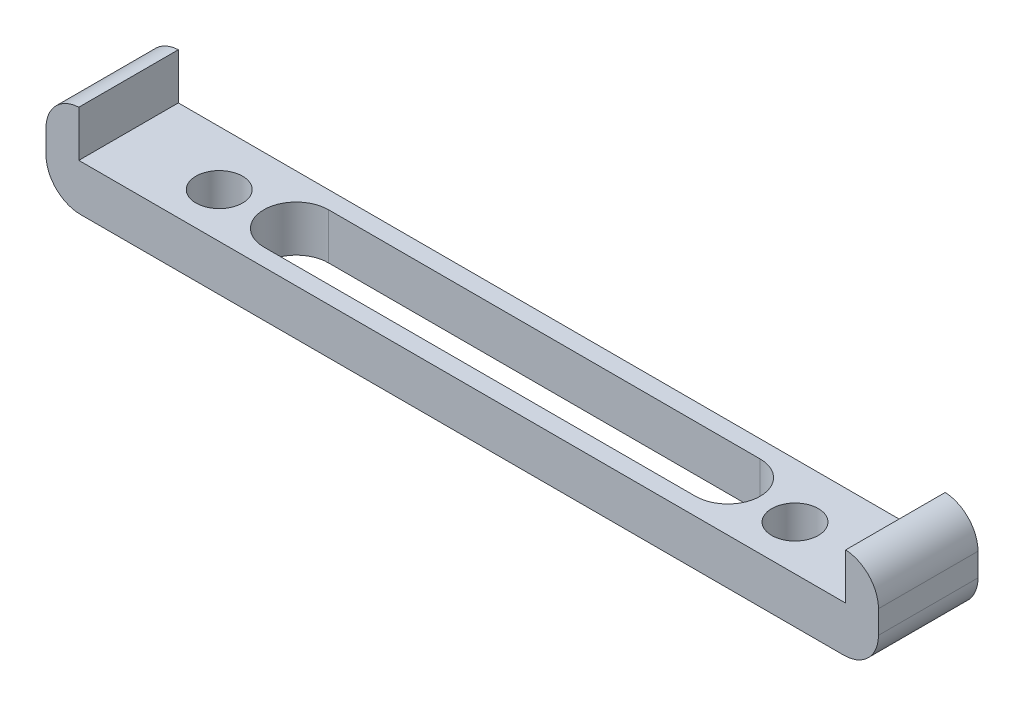
ISO-10303-21;
HEADER;
FILE_DESCRIPTION(('STEP AP214'),'2;1');
FILE_NAME('part.step','',(''),(''),'','','');
FILE_SCHEMA(('AUTOMOTIVE_DESIGN { 1 0 10303 214 1 1 1 1 }'));
ENDSEC;
DATA;
#1=APPLICATION_CONTEXT('core data for automotive mechanical design processes');
#2=APPLICATION_PROTOCOL_DEFINITION('international standard','automotive_design',2000,#1);
#3=PRODUCT_CONTEXT('',#1,'mechanical');
#4=PRODUCT('Part','Part','',(#3));
#5=PRODUCT_RELATED_PRODUCT_CATEGORY('part','',(#4));
#6=PRODUCT_DEFINITION_FORMATION('','',#4);
#7=PRODUCT_DEFINITION_CONTEXT('part definition',#1,'design');
#8=PRODUCT_DEFINITION('design','',#6,#7);
#9=PRODUCT_DEFINITION_SHAPE('','',#8);
#10=(LENGTH_UNIT() NAMED_UNIT(*) SI_UNIT(.MILLI.,.METRE.));
#11=(NAMED_UNIT(*) PLANE_ANGLE_UNIT() SI_UNIT($,.RADIAN.));
#12=(NAMED_UNIT(*) SI_UNIT($,.STERADIAN.) SOLID_ANGLE_UNIT());
#13=UNCERTAINTY_MEASURE_WITH_UNIT(LENGTH_MEASURE(1.E-05),#10,'distance_accuracy_value','');
#14=(GEOMETRIC_REPRESENTATION_CONTEXT(3) GLOBAL_UNCERTAINTY_ASSIGNED_CONTEXT((#13)) GLOBAL_UNIT_ASSIGNED_CONTEXT((#10,
#11,#12)) REPRESENTATION_CONTEXT('',''));
#15=CARTESIAN_POINT('',(0.,0.,0.));
#16=DIRECTION('',(0.,0.,1.));
#17=DIRECTION('',(1.,0.,0.));
#18=AXIS2_PLACEMENT_3D('',#15,#16,#17);
#19=CARTESIAN_POINT('',(0.,41.59,0.));
#20=DIRECTION('',(0.,1.,0.));
#21=DIRECTION('',(0.,0.,1.));
#22=AXIS2_PLACEMENT_3D('',#19,#20,#21);
#23=PLANE('',#22);
#24=CARTESIAN_POINT('',(14.4028052431113,41.59,-8.85234871179528));
#25=DIRECTION('',(0.,1.,0.));
#26=DIRECTION('',(0.,0.,1.));
#27=AXIS2_PLACEMENT_3D('',#24,#25,#26);
#28=CIRCLE('',#27,2.80817591076612);
#29=CARTESIAN_POINT('',(14.4028052431113,41.59,-11.6605246225614));
#30=VERTEX_POINT('',#29);
#31=CARTESIAN_POINT('',(14.4028052431113,41.59,-6.04417280102916));
#32=VERTEX_POINT('',#31);
#33=EDGE_CURVE('E89',#30,#32,#28,.T.);
#34=ORIENTED_EDGE('',*,*,#33,.F.);
#35=DIRECTION('',(-1.,0.,0.));
#36=VECTOR('',#35,1.);
#37=CARTESIAN_POINT('',(14.4028052431113,41.59,-11.6605246225614));
#38=LINE('',#37,#36);
#39=CARTESIAN_POINT('',(51.8871947568886,41.59,-11.6605246225614));
#40=VERTEX_POINT('',#39);
#41=EDGE_CURVE('E193',#40,#30,#38,.T.);
#42=ORIENTED_EDGE('',*,*,#41,.F.);
#43=CARTESIAN_POINT('',(51.8871947568886,41.59,-8.85234871179528));
#44=DIRECTION('',(0.,1.,0.));
#45=DIRECTION('',(0.,0.,-1.));
#46=AXIS2_PLACEMENT_3D('',#43,#44,#45);
#47=CIRCLE('',#46,2.80817591076612);
#48=CARTESIAN_POINT('',(51.8871947568886,41.59,-6.04417280102916));
#49=VERTEX_POINT('',#48);
#50=EDGE_CURVE('E178',#49,#40,#47,.T.);
#51=ORIENTED_EDGE('',*,*,#50,.F.);
#52=DIRECTION('',(1.,0.,0.));
#53=VECTOR('',#52,1.);
#54=CARTESIAN_POINT('',(14.4028052431113,41.59,-6.04417280102916));
#55=LINE('',#54,#53);
#56=EDGE_CURVE('E187',#32,#49,#55,.T.);
#57=ORIENTED_EDGE('',*,*,#56,.F.);
#58=EDGE_LOOP('',(#34,#42,#51,#57));
#59=FACE_BOUND('',#58,.T.);
#60=CARTESIAN_POINT('',(58.145,41.59,-8.43));
#61=DIRECTION('',(0.,-1.,0.));
#62=DIRECTION('',(0.,0.,1.));
#63=AXIS2_PLACEMENT_3D('',#60,#61,#62);
#64=CIRCLE('',#63,2.025);
#65=CARTESIAN_POINT('',(58.145,41.59,-6.405));
#66=VERTEX_POINT('',#65);
#67=EDGE_CURVE('E243',#66,#66,#64,.T.);
#68=ORIENTED_EDGE('',*,*,#67,.T.);
#69=EDGE_LOOP('',(#68));
#70=FACE_BOUND('',#69,.T.);
#71=CARTESIAN_POINT('',(8.145,41.59,-8.43));
#72=DIRECTION('',(0.,1.,0.));
#73=DIRECTION('',(0.,0.,1.));
#74=AXIS2_PLACEMENT_3D('',#71,#72,#73);
#75=CIRCLE('',#74,2.025);
#76=CARTESIAN_POINT('',(8.145,41.59,-6.405));
#77=VERTEX_POINT('',#76);
#78=EDGE_CURVE('E230',#77,#77,#75,.T.);
#79=ORIENTED_EDGE('',*,*,#78,.F.);
#80=EDGE_LOOP('',(#79));
#81=FACE_BOUND('',#80,.T.);
#82=DIRECTION('',(-1.,0.,0.));
#83=VECTOR('',#82,1.);
#84=CARTESIAN_POINT('',(0.,41.59,-4.53));
#85=LINE('',#84,#83);
#86=CARTESIAN_POINT('',(66.44,41.59,-4.53));
#87=VERTEX_POINT('',#86);
#88=CARTESIAN_POINT('',(-0.149999999999996,41.59,-4.53));
#89=VERTEX_POINT('',#88);
#90=EDGE_CURVE('E234',#87,#89,#85,.T.);
#91=ORIENTED_EDGE('',*,*,#90,.F.);
#92=DIRECTION('',(0.,0.,1.));
#93=VECTOR('',#92,1.);
#94=CARTESIAN_POINT('',(66.44,41.59,-13.1746974235906));
#95=LINE('',#94,#93);
#96=CARTESIAN_POINT('',(66.44,41.59,-13.1746974235906));
#97=VERTEX_POINT('',#96);
#98=EDGE_CURVE('E200',#97,#87,#95,.T.);
#99=ORIENTED_EDGE('',*,*,#98,.F.);
#100=DIRECTION('',(1.,0.,0.));
#101=VECTOR('',#100,1.);
#102=CARTESIAN_POINT('',(0.,41.59,-13.1746974235906));
#103=LINE('',#102,#101);
#104=CARTESIAN_POINT('',(-0.149999999999996,41.59,-13.1746974235906));
#105=VERTEX_POINT('',#104);
#106=EDGE_CURVE('E229',#105,#97,#103,.T.);
#107=ORIENTED_EDGE('',*,*,#106,.F.);
#108=DIRECTION('',(0.,0.,-1.));
#109=VECTOR('',#108,1.);
#110=CARTESIAN_POINT('',(-0.149999999999996,41.59,-13.1746974235906));
#111=LINE('',#110,#109);
#112=EDGE_CURVE('E212',#89,#105,#111,.T.);
#113=ORIENTED_EDGE('',*,*,#112,.F.);
#114=EDGE_LOOP('',(#91,#99,#107,#113));
#115=FACE_BOUND('',#114,.T.);
#116=ADVANCED_FACE('F74',(#59,#70,#81,#115),#23,.T.);
#117=CARTESIAN_POINT('',(58.145,37.59,-8.43));
#118=DIRECTION('',(0.,1.,0.));
#119=DIRECTION('',(-1.,0.,0.));
#120=AXIS2_PLACEMENT_3D('',#117,#118,#119);
#121=CYLINDRICAL_SURFACE('',#120,2.025);
#122=CARTESIAN_POINT('',(58.145,37.59,-8.43));
#123=DIRECTION('',(0.,-1.,0.));
#124=DIRECTION('',(0.,0.,1.));
#125=AXIS2_PLACEMENT_3D('',#122,#123,#124);
#126=CIRCLE('',#125,2.025);
#127=CARTESIAN_POINT('',(58.145,37.59,-6.405));
#128=VERTEX_POINT('',#127);
#129=EDGE_CURVE('E224',#128,#128,#126,.T.);
#130=ORIENTED_EDGE('',*,*,#129,.T.);
#131=EDGE_LOOP('',(#130));
#132=FACE_BOUND('',#131,.T.);
#133=ORIENTED_EDGE('',*,*,#67,.F.);
#134=EDGE_LOOP('',(#133));
#135=FACE_BOUND('',#134,.T.);
#136=ADVANCED_FACE('F311',(#132,#135),#121,.F.);
#137=CARTESIAN_POINT('',(8.145,37.59,-8.43));
#138=DIRECTION('',(0.,1.,0.));
#139=DIRECTION('',(0.,0.,1.));
#140=AXIS2_PLACEMENT_3D('',#137,#138,#139);
#141=CYLINDRICAL_SURFACE('',#140,2.025);
#142=CARTESIAN_POINT('',(8.145,37.59,-8.43));
#143=DIRECTION('',(0.,1.,0.));
#144=DIRECTION('',(0.,0.,1.));
#145=AXIS2_PLACEMENT_3D('',#142,#143,#144);
#146=CIRCLE('',#145,2.025);
#147=CARTESIAN_POINT('',(8.145,37.59,-6.405));
#148=VERTEX_POINT('',#147);
#149=EDGE_CURVE('E225',#148,#148,#146,.T.);
#150=ORIENTED_EDGE('',*,*,#149,.F.);
#151=EDGE_LOOP('',(#150));
#152=FACE_BOUND('',#151,.T.);
#153=ORIENTED_EDGE('',*,*,#78,.T.);
#154=EDGE_LOOP('',(#153));
#155=FACE_BOUND('',#154,.T.);
#156=ADVANCED_FACE('F316',(#152,#155),#141,.F.);
#157=CARTESIAN_POINT('',(-2.99999999999999,37.59,0.));
#158=DIRECTION('',(-1.,0.,0.));
#159=DIRECTION('',(0.,0.,1.));
#160=AXIS2_PLACEMENT_3D('',#157,#158,#159);
#161=PLANE('',#160);
#162=DIRECTION('',(0.,1.,0.));
#163=VECTOR('',#162,1.);
#164=CARTESIAN_POINT('',(-2.99999999999999,37.59,-4.53));
#165=LINE('',#164,#163);
#166=CARTESIAN_POINT('',(-2.99999999999999,40.59,-4.53));
#167=VERTEX_POINT('',#166);
#168=CARTESIAN_POINT('',(-2.99999999999999,42.5937523466843,-4.53));
#169=VERTEX_POINT('',#168);
#170=EDGE_CURVE('E233',#167,#169,#165,.T.);
#171=ORIENTED_EDGE('',*,*,#170,.T.);
#172=DIRECTION('',(0.,0.,-1.));
#173=VECTOR('',#172,1.);
#174=CARTESIAN_POINT('',(-3.,42.5937523466843,-13.1746974235906));
#175=LINE('',#174,#173);
#176=CARTESIAN_POINT('',(-3.,42.5937523466843,-13.1746974235906));
#177=VERTEX_POINT('',#176);
#178=EDGE_CURVE('E282',#169,#177,#175,.T.);
#179=ORIENTED_EDGE('',*,*,#178,.T.);
#180=DIRECTION('',(0.,1.,0.));
#181=VECTOR('',#180,1.);
#182=CARTESIAN_POINT('',(-3.,37.59,-13.1746974235906));
#183=LINE('',#182,#181);
#184=CARTESIAN_POINT('',(-3.,40.59,-13.1746974235906));
#185=VERTEX_POINT('',#184);
#186=EDGE_CURVE('E240',#185,#177,#183,.T.);
#187=ORIENTED_EDGE('',*,*,#186,.F.);
#188=DIRECTION('',(0.,0.,1.));
#189=VECTOR('',#188,1.);
#190=CARTESIAN_POINT('',(-2.99999999999999,40.59,-4.53));
#191=LINE('',#190,#189);
#192=EDGE_CURVE('E279',#185,#167,#191,.T.);
#193=ORIENTED_EDGE('',*,*,#192,.T.);
#194=EDGE_LOOP('',(#171,#179,#187,#193));
#195=FACE_BOUND('',#194,.T.);
#196=ADVANCED_FACE('F349',(#195),#161,.T.);
#197=CARTESIAN_POINT('',(69.29,37.59,0.));
#198=DIRECTION('',(-1.,0.,0.));
#199=DIRECTION('',(0.,-1.,0.));
#200=AXIS2_PLACEMENT_3D('',#197,#198,#199);
#201=PLANE('',#200);
#202=DIRECTION('',(0.,1.,0.));
#203=VECTOR('',#202,1.);
#204=CARTESIAN_POINT('',(69.29,37.59,-13.1746974235906));
#205=LINE('',#204,#203);
#206=CARTESIAN_POINT('',(69.29,40.59,-13.1746974235906));
#207=VERTEX_POINT('',#206);
#208=CARTESIAN_POINT('',(69.29,42.5937523466843,-13.1746974235906));
#209=VERTEX_POINT('',#208);
#210=EDGE_CURVE('E249',#207,#209,#205,.T.);
#211=ORIENTED_EDGE('',*,*,#210,.T.);
#212=DIRECTION('',(0.,0.,1.));
#213=VECTOR('',#212,1.);
#214=CARTESIAN_POINT('',(69.29,42.5937523466843,0.));
#215=LINE('',#214,#213);
#216=CARTESIAN_POINT('',(69.29,42.5937523466843,-4.53000000000001));
#217=VERTEX_POINT('',#216);
#218=EDGE_CURVE('E269',#209,#217,#215,.T.);
#219=ORIENTED_EDGE('',*,*,#218,.T.);
#220=DIRECTION('',(0.,1.,0.));
#221=VECTOR('',#220,1.);
#222=CARTESIAN_POINT('',(69.29,37.59,-4.53));
#223=LINE('',#222,#221);
#224=CARTESIAN_POINT('',(69.29,40.59,-4.53));
#225=VERTEX_POINT('',#224);
#226=EDGE_CURVE('E237',#225,#217,#223,.T.);
#227=ORIENTED_EDGE('',*,*,#226,.F.);
#228=DIRECTION('',(0.,0.,1.));
#229=VECTOR('',#228,1.);
#230=CARTESIAN_POINT('',(69.29,40.59,0.));
#231=LINE('',#230,#229);
#232=EDGE_CURVE('E267',#225,#207,#231,.F.);
#233=ORIENTED_EDGE('',*,*,#232,.T.);
#234=EDGE_LOOP('',(#211,#219,#227,#233));
#235=FACE_BOUND('',#234,.T.);
#236=ADVANCED_FACE('F368',(#235),#201,.F.);
#237=CARTESIAN_POINT('',(66.29,37.59,0.));
#238=DIRECTION('',(0.,1.,0.));
#239=DIRECTION('',(0.,0.,1.));
#240=AXIS2_PLACEMENT_3D('',#237,#238,#239);
#241=PLANE('',#240);
#242=DIRECTION('',(-1.,0.,0.));
#243=VECTOR('',#242,1.);
#244=CARTESIAN_POINT('',(66.29,37.59,-11.6605246225614));
#245=LINE('',#244,#243);
#246=CARTESIAN_POINT('',(51.8871947568886,37.59,-11.6605246225614));
#247=VERTEX_POINT('',#246);
#248=CARTESIAN_POINT('',(14.4028052431113,37.59,-11.6605246225614));
#249=VERTEX_POINT('',#248);
#250=EDGE_CURVE('E82',#247,#249,#245,.T.);
#251=ORIENTED_EDGE('',*,*,#250,.T.);
#252=CARTESIAN_POINT('',(14.4028052431113,37.59,-8.85234871179528));
#253=DIRECTION('',(0.,1.,0.));
#254=DIRECTION('',(-1.,0.,0.));
#255=AXIS2_PLACEMENT_3D('',#252,#253,#254);
#256=CIRCLE('',#255,2.80817591076612);
#257=CARTESIAN_POINT('',(14.4028052431113,37.59,-6.04417280102916));
#258=VERTEX_POINT('',#257);
#259=EDGE_CURVE('E12',#249,#258,#256,.T.);
#260=ORIENTED_EDGE('',*,*,#259,.T.);
#261=DIRECTION('',(1.,0.,0.));
#262=VECTOR('',#261,1.);
#263=CARTESIAN_POINT('',(66.29,37.59,-6.04417280102916));
#264=LINE('',#263,#262);
#265=CARTESIAN_POINT('',(51.8871947568886,37.59,-6.04417280102916));
#266=VERTEX_POINT('',#265);
#267=EDGE_CURVE('E289',#258,#266,#264,.T.);
#268=ORIENTED_EDGE('',*,*,#267,.T.);
#269=CARTESIAN_POINT('',(51.8871947568886,37.59,-8.85234871179528));
#270=DIRECTION('',(0.,1.,0.));
#271=DIRECTION('',(-1.,0.,0.));
#272=AXIS2_PLACEMENT_3D('',#269,#270,#271);
#273=CIRCLE('',#272,2.80817591076612);
#274=EDGE_CURVE('E181',#266,#247,#273,.T.);
#275=ORIENTED_EDGE('',*,*,#274,.T.);
#276=EDGE_LOOP('',(#251,#260,#268,#275));
#277=FACE_BOUND('',#276,.T.);
#278=DIRECTION('',(-1.,0.,0.));
#279=VECTOR('',#278,1.);
#280=CARTESIAN_POINT('',(66.29,37.59,-13.1746974235906));
#281=LINE('',#280,#279);
#282=CARTESIAN_POINT('',(66.29,37.59,-13.1746974235906));
#283=VERTEX_POINT('',#282);
#284=CARTESIAN_POINT('',(0.,37.59,-13.1746974235906));
#285=VERTEX_POINT('',#284);
#286=EDGE_CURVE('E236',#283,#285,#281,.T.);
#287=ORIENTED_EDGE('',*,*,#286,.F.);
#288=DIRECTION('',(0.,0.,1.));
#289=VECTOR('',#288,1.);
#290=CARTESIAN_POINT('',(66.29,37.59,0.));
#291=LINE('',#290,#289);
#292=CARTESIAN_POINT('',(66.29,37.59,-4.53000000000001));
#293=VERTEX_POINT('',#292);
#294=EDGE_CURVE('E286',#283,#293,#291,.T.);
#295=ORIENTED_EDGE('',*,*,#294,.T.);
#296=DIRECTION('',(1.,0.,0.));
#297=VECTOR('',#296,1.);
#298=CARTESIAN_POINT('',(0.,37.59,-4.53));
#299=LINE('',#298,#297);
#300=CARTESIAN_POINT('',(0.,37.59,-4.53));
#301=VERTEX_POINT('',#300);
#302=EDGE_CURVE('E248',#301,#293,#299,.T.);
#303=ORIENTED_EDGE('',*,*,#302,.F.);
#304=DIRECTION('',(0.,0.,1.));
#305=VECTOR('',#304,1.);
#306=CARTESIAN_POINT('',(0.,37.59,-13.1746974235906));
#307=LINE('',#306,#305);
#308=EDGE_CURVE('E284',#301,#285,#307,.F.);
#309=ORIENTED_EDGE('',*,*,#308,.T.);
#310=EDGE_LOOP('',(#287,#295,#303,#309));
#311=FACE_BOUND('',#310,.T.);
#312=ORIENTED_EDGE('',*,*,#149,.T.);
#313=EDGE_LOOP('',(#312));
#314=FACE_BOUND('',#313,.T.);
#315=ORIENTED_EDGE('',*,*,#129,.F.);
#316=EDGE_LOOP('',(#315));
#317=FACE_BOUND('',#316,.T.);
#318=ADVANCED_FACE('F293',(#277,#311,#314,#317),#241,.F.);
#319=CARTESIAN_POINT('',(0.,37.59,-4.53));
#320=DIRECTION('',(0.,0.,-1.));
#321=DIRECTION('',(-1.,0.,0.));
#322=AXIS2_PLACEMENT_3D('',#319,#320,#321);
#323=PLANE('',#322);
#324=ORIENTED_EDGE('',*,*,#226,.T.);
#325=CARTESIAN_POINT('',(66.2899999999999,42.5937523466843,-4.53000000000001));
#326=DIRECTION('',(0.,0.,-1.));
#327=DIRECTION('',(-1.,0.,0.));
#328=AXIS2_PLACEMENT_3D('',#325,#326,#327);
#329=CIRCLE('',#328,3.);
#330=CARTESIAN_POINT('',(66.44,45.59,-4.53));
#331=VERTEX_POINT('',#330);
#332=EDGE_CURVE('E277',#217,#331,#329,.F.);
#333=ORIENTED_EDGE('',*,*,#332,.T.);
#334=DIRECTION('',(0.,-1.,0.));
#335=VECTOR('',#334,1.);
#336=CARTESIAN_POINT('',(66.44,45.59,-4.53));
#337=LINE('',#336,#335);
#338=EDGE_CURVE('E206',#331,#87,#337,.T.);
#339=ORIENTED_EDGE('',*,*,#338,.T.);
#340=ORIENTED_EDGE('',*,*,#90,.T.);
#341=DIRECTION('',(0.,-1.,0.));
#342=VECTOR('',#341,1.);
#343=CARTESIAN_POINT('',(-0.149999999999997,45.59,-4.53));
#344=LINE('',#343,#342);
#345=CARTESIAN_POINT('',(-0.149999999999997,45.59,-4.53));
#346=VERTEX_POINT('',#345);
#347=EDGE_CURVE('E221',#346,#89,#344,.T.);
#348=ORIENTED_EDGE('',*,*,#347,.F.);
#349=CARTESIAN_POINT('',(0.,42.5937523466843,-4.53));
#350=DIRECTION('',(0.,0.,-1.));
#351=DIRECTION('',(-1.,0.,0.));
#352=AXIS2_PLACEMENT_3D('',#349,#350,#351);
#353=CIRCLE('',#352,3.);
#354=EDGE_CURVE('E275',#346,#169,#353,.F.);
#355=ORIENTED_EDGE('',*,*,#354,.T.);
#356=ORIENTED_EDGE('',*,*,#170,.F.);
#357=CARTESIAN_POINT('',(0.,40.59,-4.53));
#358=DIRECTION('',(0.,0.,-1.));
#359=DIRECTION('',(-1.,0.,0.));
#360=AXIS2_PLACEMENT_3D('',#357,#358,#359);
#361=CIRCLE('',#360,3.);
#362=EDGE_CURVE('E271',#167,#301,#361,.F.);
#363=ORIENTED_EDGE('',*,*,#362,.T.);
#364=ORIENTED_EDGE('',*,*,#302,.T.);
#365=CARTESIAN_POINT('',(66.29,40.59,-4.53000000000001));
#366=DIRECTION('',(0.,0.,-1.));
#367=DIRECTION('',(-1.,0.,0.));
#368=AXIS2_PLACEMENT_3D('',#365,#366,#367);
#369=CIRCLE('',#368,3.);
#370=EDGE_CURVE('E273',#293,#225,#369,.F.);
#371=ORIENTED_EDGE('',*,*,#370,.T.);
#372=EDGE_LOOP('',(#324,#333,#339,#340,#348,#355,#356,#363,#364,#371));
#373=FACE_BOUND('',#372,.T.);
#374=ADVANCED_FACE('F370',(#373),#323,.F.);
#375=CARTESIAN_POINT('',(0.,37.59,-13.1746974235906));
#376=DIRECTION('',(0.,0.,1.));
#377=DIRECTION('',(1.,0.,0.));
#378=AXIS2_PLACEMENT_3D('',#375,#376,#377);
#379=PLANE('',#378);
#380=DIRECTION('',(0.,-1.,0.));
#381=VECTOR('',#380,1.);
#382=CARTESIAN_POINT('',(66.44,45.59,-13.1746974235906));
#383=LINE('',#382,#381);
#384=CARTESIAN_POINT('',(66.44,45.59,-13.1746974235906));
#385=VERTEX_POINT('',#384);
#386=EDGE_CURVE('E210',#385,#97,#383,.T.);
#387=ORIENTED_EDGE('',*,*,#386,.F.);
#388=CARTESIAN_POINT('',(66.2899999999999,42.5937523466843,-13.1746974235906));
#389=DIRECTION('',(0.,0.,1.));
#390=DIRECTION('',(1.,0.,0.));
#391=AXIS2_PLACEMENT_3D('',#388,#389,#390);
#392=CIRCLE('',#391,3.);
#393=EDGE_CURVE('E265',#385,#209,#392,.F.);
#394=ORIENTED_EDGE('',*,*,#393,.T.);
#395=ORIENTED_EDGE('',*,*,#210,.F.);
#396=CARTESIAN_POINT('',(66.29,40.59,-13.1746974235906));
#397=DIRECTION('',(0.,0.,1.));
#398=DIRECTION('',(1.,0.,0.));
#399=AXIS2_PLACEMENT_3D('',#396,#397,#398);
#400=CIRCLE('',#399,3.);
#401=EDGE_CURVE('E261',#207,#283,#400,.F.);
#402=ORIENTED_EDGE('',*,*,#401,.T.);
#403=ORIENTED_EDGE('',*,*,#286,.T.);
#404=CARTESIAN_POINT('',(0.,40.59,-13.1746974235906));
#405=DIRECTION('',(0.,0.,1.));
#406=DIRECTION('',(1.,0.,0.));
#407=AXIS2_PLACEMENT_3D('',#404,#405,#406);
#408=CIRCLE('',#407,3.);
#409=EDGE_CURVE('E228',#285,#185,#408,.F.);
#410=ORIENTED_EDGE('',*,*,#409,.T.);
#411=ORIENTED_EDGE('',*,*,#186,.T.);
#412=CARTESIAN_POINT('',(0.,42.5937523466843,-13.1746974235906));
#413=DIRECTION('',(0.,0.,1.));
#414=DIRECTION('',(1.,0.,0.));
#415=AXIS2_PLACEMENT_3D('',#412,#413,#414);
#416=CIRCLE('',#415,3.);
#417=CARTESIAN_POINT('',(-0.149999999999996,45.59,-13.1746974235906));
#418=VERTEX_POINT('',#417);
#419=EDGE_CURVE('E263',#177,#418,#416,.F.);
#420=ORIENTED_EDGE('',*,*,#419,.T.);
#421=DIRECTION('',(0.,-1.,0.));
#422=VECTOR('',#421,1.);
#423=CARTESIAN_POINT('',(-0.149999999999996,45.59,-13.1746974235906));
#424=LINE('',#423,#422);
#425=EDGE_CURVE('E216',#418,#105,#424,.T.);
#426=ORIENTED_EDGE('',*,*,#425,.T.);
#427=ORIENTED_EDGE('',*,*,#106,.T.);
#428=EDGE_LOOP('',(#387,#394,#395,#402,#403,#410,#411,#420,#426,#427));
#429=FACE_BOUND('',#428,.T.);
#430=ADVANCED_FACE('F340',(#429),#379,.F.);
#431=CARTESIAN_POINT('',(-0.149999999999996,45.59,-13.1746974235906));
#432=DIRECTION('',(-1.,0.,0.));
#433=DIRECTION('',(0.,0.,1.));
#434=AXIS2_PLACEMENT_3D('',#431,#432,#433);
#435=PLANE('',#434);
#436=ORIENTED_EDGE('',*,*,#112,.T.);
#437=ORIENTED_EDGE('',*,*,#425,.F.);
#438=DIRECTION('',(0.,0.,-1.));
#439=VECTOR('',#438,1.);
#440=CARTESIAN_POINT('',(-0.149999999999996,45.59,-13.1746974235906));
#441=LINE('',#440,#439);
#442=EDGE_CURVE('E213',#346,#418,#441,.T.);
#443=ORIENTED_EDGE('',*,*,#442,.F.);
#444=ORIENTED_EDGE('',*,*,#347,.T.);
#445=EDGE_LOOP('',(#436,#437,#443,#444));
#446=FACE_BOUND('',#445,.T.);
#447=ADVANCED_FACE('F356',(#446),#435,.F.);
#448=CARTESIAN_POINT('',(66.44,45.59,-13.1746974235906));
#449=DIRECTION('',(1.,0.,0.));
#450=DIRECTION('',(0.,0.,-1.));
#451=AXIS2_PLACEMENT_3D('',#448,#449,#450);
#452=PLANE('',#451);
#453=ORIENTED_EDGE('',*,*,#98,.T.);
#454=ORIENTED_EDGE('',*,*,#338,.F.);
#455=DIRECTION('',(0.,0.,1.));
#456=VECTOR('',#455,1.);
#457=CARTESIAN_POINT('',(66.44,45.59,-13.1746974235906));
#458=LINE('',#457,#456);
#459=EDGE_CURVE('E203',#385,#331,#458,.T.);
#460=ORIENTED_EDGE('',*,*,#459,.F.);
#461=ORIENTED_EDGE('',*,*,#386,.T.);
#462=EDGE_LOOP('',(#453,#454,#460,#461));
#463=FACE_BOUND('',#462,.T.);
#464=ADVANCED_FACE('F325',(#463),#452,.F.);
#465=CARTESIAN_POINT('',(66.2899999999999,42.5937523466843,0.));
#466=DIRECTION('',(0.,0.,1.));
#467=DIRECTION('',(1.,0.,0.));
#468=AXIS2_PLACEMENT_3D('',#465,#466,#467);
#469=CYLINDRICAL_SURFACE('',#468,3.);
#470=ORIENTED_EDGE('',*,*,#332,.F.);
#471=ORIENTED_EDGE('',*,*,#218,.F.);
#472=ORIENTED_EDGE('',*,*,#393,.F.);
#473=ORIENTED_EDGE('',*,*,#459,.T.);
#474=EDGE_LOOP('',(#470,#471,#472,#473));
#475=FACE_BOUND('',#474,.T.);
#476=ADVANCED_FACE('F321',(#475),#469,.T.);
#477=CARTESIAN_POINT('',(0.,42.5937523466843,0.));
#478=DIRECTION('',(0.,0.,1.));
#479=DIRECTION('',(1.,0.,0.));
#480=AXIS2_PLACEMENT_3D('',#477,#478,#479);
#481=CYLINDRICAL_SURFACE('',#480,3.);
#482=ORIENTED_EDGE('',*,*,#419,.F.);
#483=ORIENTED_EDGE('',*,*,#178,.F.);
#484=ORIENTED_EDGE('',*,*,#354,.F.);
#485=ORIENTED_EDGE('',*,*,#442,.T.);
#486=EDGE_LOOP('',(#482,#483,#484,#485));
#487=FACE_BOUND('',#486,.T.);
#488=ADVANCED_FACE('F324',(#487),#481,.T.);
#489=CARTESIAN_POINT('',(66.29,40.59,0.));
#490=DIRECTION('',(0.,0.,1.));
#491=DIRECTION('',(1.,0.,0.));
#492=AXIS2_PLACEMENT_3D('',#489,#490,#491);
#493=CYLINDRICAL_SURFACE('',#492,3.);
#494=ORIENTED_EDGE('',*,*,#401,.F.);
#495=ORIENTED_EDGE('',*,*,#232,.F.);
#496=ORIENTED_EDGE('',*,*,#370,.F.);
#497=ORIENTED_EDGE('',*,*,#294,.F.);
#498=EDGE_LOOP('',(#494,#495,#496,#497));
#499=FACE_BOUND('',#498,.T.);
#500=ADVANCED_FACE('F306',(#499),#493,.T.);
#501=CARTESIAN_POINT('',(0.,40.59,0.));
#502=DIRECTION('',(0.,0.,-1.));
#503=DIRECTION('',(-1.,0.,0.));
#504=AXIS2_PLACEMENT_3D('',#501,#502,#503);
#505=CYLINDRICAL_SURFACE('',#504,3.);
#506=ORIENTED_EDGE('',*,*,#409,.F.);
#507=ORIENTED_EDGE('',*,*,#308,.F.);
#508=ORIENTED_EDGE('',*,*,#362,.F.);
#509=ORIENTED_EDGE('',*,*,#192,.F.);
#510=EDGE_LOOP('',(#506,#507,#508,#509));
#511=FACE_BOUND('',#510,.T.);
#512=ADVANCED_FACE('F76',(#511),#505,.T.);
#513=CARTESIAN_POINT('',(14.4028052431113,31.59,-8.85234871179528));
#514=DIRECTION('',(0.,1.,0.));
#515=DIRECTION('',(0.,0.,1.));
#516=AXIS2_PLACEMENT_3D('',#513,#514,#515);
#517=CYLINDRICAL_SURFACE('',#516,2.80817591076612);
#518=DIRECTION('',(0.,1.,0.));
#519=VECTOR('',#518,1.);
#520=CARTESIAN_POINT('',(14.4028052431113,31.59,-11.6605246225614));
#521=LINE('',#520,#519);
#522=EDGE_CURVE('E198',#249,#30,#521,.T.);
#523=ORIENTED_EDGE('',*,*,#522,.T.);
#524=ORIENTED_EDGE('',*,*,#33,.T.);
#525=DIRECTION('',(0.,1.,0.));
#526=VECTOR('',#525,1.);
#527=CARTESIAN_POINT('',(14.4028052431113,31.59,-6.04417280102916));
#528=LINE('',#527,#526);
#529=EDGE_CURVE('E184',#258,#32,#528,.T.);
#530=ORIENTED_EDGE('',*,*,#529,.F.);
#531=ORIENTED_EDGE('',*,*,#259,.F.);
#532=EDGE_LOOP('',(#523,#524,#530,#531));
#533=FACE_BOUND('',#532,.T.);
#534=ADVANCED_FACE('F298',(#533),#517,.F.);
#535=CARTESIAN_POINT('',(14.4028052431113,31.59,-11.6605246225614));
#536=DIRECTION('',(0.,0.,-1.));
#537=DIRECTION('',(-1.,0.,0.));
#538=AXIS2_PLACEMENT_3D('',#535,#536,#537);
#539=PLANE('',#538);
#540=DIRECTION('',(0.,1.,0.));
#541=VECTOR('',#540,1.);
#542=CARTESIAN_POINT('',(51.8871947568886,31.59,-11.6605246225614));
#543=LINE('',#542,#541);
#544=EDGE_CURVE('E183',#247,#40,#543,.T.);
#545=ORIENTED_EDGE('',*,*,#544,.T.);
#546=ORIENTED_EDGE('',*,*,#41,.T.);
#547=ORIENTED_EDGE('',*,*,#522,.F.);
#548=ORIENTED_EDGE('',*,*,#250,.F.);
#549=EDGE_LOOP('',(#545,#546,#547,#548));
#550=FACE_BOUND('',#549,.T.);
#551=ADVANCED_FACE('F297',(#550),#539,.F.);
#552=CARTESIAN_POINT('',(51.8871947568886,31.59,-8.85234871179528));
#553=DIRECTION('',(0.,1.,0.));
#554=DIRECTION('',(0.,0.,1.));
#555=AXIS2_PLACEMENT_3D('',#552,#553,#554);
#556=CYLINDRICAL_SURFACE('',#555,2.80817591076612);
#557=DIRECTION('',(0.,1.,0.));
#558=VECTOR('',#557,1.);
#559=CARTESIAN_POINT('',(51.8871947568886,31.59,-6.04417280102916));
#560=LINE('',#559,#558);
#561=EDGE_CURVE('E97',#266,#49,#560,.T.);
#562=ORIENTED_EDGE('',*,*,#561,.T.);
#563=ORIENTED_EDGE('',*,*,#50,.T.);
#564=ORIENTED_EDGE('',*,*,#544,.F.);
#565=ORIENTED_EDGE('',*,*,#274,.F.);
#566=EDGE_LOOP('',(#562,#563,#564,#565));
#567=FACE_BOUND('',#566,.T.);
#568=ADVANCED_FACE('F175',(#567),#556,.F.);
#569=CARTESIAN_POINT('',(14.4028052431113,31.59,-6.04417280102916));
#570=DIRECTION('',(0.,0.,1.));
#571=DIRECTION('',(1.,0.,0.));
#572=AXIS2_PLACEMENT_3D('',#569,#570,#571);
#573=PLANE('',#572);
#574=ORIENTED_EDGE('',*,*,#529,.T.);
#575=ORIENTED_EDGE('',*,*,#56,.T.);
#576=ORIENTED_EDGE('',*,*,#561,.F.);
#577=ORIENTED_EDGE('',*,*,#267,.F.);
#578=EDGE_LOOP('',(#574,#575,#576,#577));
#579=FACE_BOUND('',#578,.T.);
#580=ADVANCED_FACE('F188',(#579),#573,.F.);
#581=CLOSED_SHELL('',(#116,#136,#156,#196,#236,#318,#374,#430,#447,#464,#476,#488,#500,#512,
#534,#551,#568,#580));
#582=MANIFOLD_SOLID_BREP('B2',#581);
#583=ADVANCED_BREP_SHAPE_REPRESENTATION('',(#18,#582),#14);
#584=SHAPE_DEFINITION_REPRESENTATION(#9,#583);
ENDSEC;
END-ISO-10303-21;
